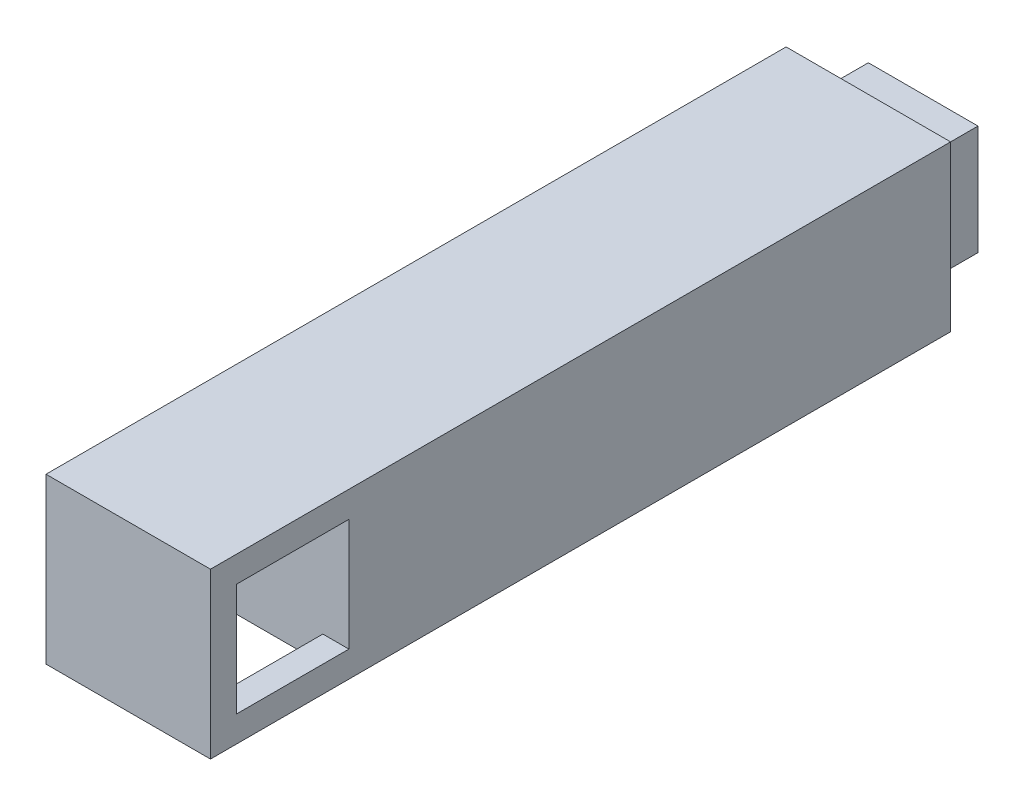
ISO-10303-21;
HEADER;
FILE_DESCRIPTION(('STEP AP214'),'2;1');
FILE_NAME('part.step','',(''),(''),'','','');
FILE_SCHEMA(('AUTOMOTIVE_DESIGN { 1 0 10303 214 1 1 1 1 }'));
ENDSEC;
DATA;
#1=APPLICATION_CONTEXT('core data for automotive mechanical design processes');
#2=APPLICATION_PROTOCOL_DEFINITION('international standard','automotive_design',2000,#1);
#3=PRODUCT_CONTEXT('',#1,'mechanical');
#4=PRODUCT('Part','Part','',(#3));
#5=PRODUCT_RELATED_PRODUCT_CATEGORY('part','',(#4));
#6=PRODUCT_DEFINITION_FORMATION('','',#4);
#7=PRODUCT_DEFINITION_CONTEXT('part definition',#1,'design');
#8=PRODUCT_DEFINITION('design','',#6,#7);
#9=PRODUCT_DEFINITION_SHAPE('','',#8);
#10=(LENGTH_UNIT() NAMED_UNIT(*) SI_UNIT(.MILLI.,.METRE.));
#11=(NAMED_UNIT(*) PLANE_ANGLE_UNIT() SI_UNIT($,.RADIAN.));
#12=(NAMED_UNIT(*) SI_UNIT($,.STERADIAN.) SOLID_ANGLE_UNIT());
#13=UNCERTAINTY_MEASURE_WITH_UNIT(LENGTH_MEASURE(1.E-05),#10,'distance_accuracy_value','');
#14=(GEOMETRIC_REPRESENTATION_CONTEXT(3) GLOBAL_UNCERTAINTY_ASSIGNED_CONTEXT((#13)) GLOBAL_UNIT_ASSIGNED_CONTEXT((#10,
#11,#12)) REPRESENTATION_CONTEXT('',''));
#15=CARTESIAN_POINT('',(0.,0.,0.));
#16=DIRECTION('',(0.,0.,1.));
#17=DIRECTION('',(1.,0.,0.));
#18=AXIS2_PLACEMENT_3D('',#15,#16,#17);
#19=CARTESIAN_POINT('',(0.,0.,0.));
#20=DIRECTION('',(1.,0.,0.));
#21=DIRECTION('',(0.,0.,-1.));
#22=AXIS2_PLACEMENT_3D('',#19,#20,#21);
#23=PLANE('',#22);
#24=DIRECTION('',(0.,-1.,0.));
#25=VECTOR('',#24,1.);
#26=CARTESIAN_POINT('',(0.,10.25,130.25));
#27=LINE('',#26,#25);
#28=CARTESIAN_POINT('',(0.,10.25,130.25));
#29=VERTEX_POINT('',#28);
#30=CARTESIAN_POINT('',(0.,0.,130.25));
#31=VERTEX_POINT('',#30);
#32=EDGE_CURVE('E188',#29,#31,#27,.T.);
#33=ORIENTED_EDGE('',*,*,#32,.T.);
#34=DIRECTION('',(0.,0.,-1.));
#35=VECTOR('',#34,1.);
#36=CARTESIAN_POINT('',(0.,0.,0.));
#37=LINE('',#36,#35);
#38=CARTESIAN_POINT('',(0.,0.,109.75));
#39=VERTEX_POINT('',#38);
#40=EDGE_CURVE('E51',#31,#39,#37,.T.);
#41=ORIENTED_EDGE('',*,*,#40,.T.);
#42=DIRECTION('',(0.,1.,0.));
#43=VECTOR('',#42,1.);
#44=CARTESIAN_POINT('',(0.,-10.25,109.75));
#45=LINE('',#44,#43);
#46=CARTESIAN_POINT('',(0.,10.25,109.75));
#47=VERTEX_POINT('',#46);
#48=EDGE_CURVE('E170',#39,#47,#45,.T.);
#49=ORIENTED_EDGE('',*,*,#48,.T.);
#50=DIRECTION('',(0.,0.,1.));
#51=VECTOR('',#50,1.);
#52=CARTESIAN_POINT('',(0.,10.25,109.75));
#53=LINE('',#52,#51);
#54=EDGE_CURVE('E192',#47,#29,#53,.T.);
#55=ORIENTED_EDGE('',*,*,#54,.T.);
#56=EDGE_LOOP('',(#33,#41,#49,#55));
#57=FACE_BOUND('',#56,.T.);
#58=ADVANCED_FACE('F43',(#57),#23,.T.);
#59=CARTESIAN_POINT('',(0.,0.,0.));
#60=DIRECTION('',(0.,0.,-1.));
#61=DIRECTION('',(-1.,0.,0.));
#62=AXIS2_PLACEMENT_3D('',#59,#60,#61);
#63=PLANE('',#62);
#64=DIRECTION('',(0.,-1.,0.));
#65=VECTOR('',#64,1.);
#66=CARTESIAN_POINT('',(-15.,-15.,0.));
#67=LINE('',#66,#65);
#68=CARTESIAN_POINT('',(-15.,15.,0.));
#69=VERTEX_POINT('',#68);
#70=CARTESIAN_POINT('',(-15.,-15.,0.));
#71=VERTEX_POINT('',#70);
#72=EDGE_CURVE('E241',#69,#71,#67,.T.);
#73=ORIENTED_EDGE('',*,*,#72,.F.);
#74=DIRECTION('',(-1.,0.,0.));
#75=VECTOR('',#74,1.);
#76=CARTESIAN_POINT('',(-15.,15.,0.));
#77=LINE('',#76,#75);
#78=CARTESIAN_POINT('',(15.,15.,0.));
#79=VERTEX_POINT('',#78);
#80=EDGE_CURVE('E255',#79,#69,#77,.T.);
#81=ORIENTED_EDGE('',*,*,#80,.F.);
#82=DIRECTION('',(0.,1.,0.));
#83=VECTOR('',#82,1.);
#84=CARTESIAN_POINT('',(15.,-15.,0.));
#85=LINE('',#84,#83);
#86=CARTESIAN_POINT('',(15.,-15.,0.));
#87=VERTEX_POINT('',#86);
#88=EDGE_CURVE('E264',#87,#79,#85,.T.);
#89=ORIENTED_EDGE('',*,*,#88,.F.);
#90=DIRECTION('',(1.,0.,0.));
#91=VECTOR('',#90,1.);
#92=CARTESIAN_POINT('',(-15.,-15.,0.));
#93=LINE('',#92,#91);
#94=EDGE_CURVE('E263',#71,#87,#93,.T.);
#95=ORIENTED_EDGE('',*,*,#94,.F.);
#96=EDGE_LOOP('',(#73,#81,#89,#95));
#97=FACE_BOUND('',#96,.T.);
#98=DIRECTION('',(-1.,0.,0.));
#99=VECTOR('',#98,1.);
#100=CARTESIAN_POINT('',(-10.,10.,0.));
#101=LINE('',#100,#99);
#102=CARTESIAN_POINT('',(10.,10.,0.));
#103=VERTEX_POINT('',#102);
#104=CARTESIAN_POINT('',(-10.,10.,0.));
#105=VERTEX_POINT('',#104);
#106=EDGE_CURVE('E222',#103,#105,#101,.T.);
#107=ORIENTED_EDGE('',*,*,#106,.T.);
#108=DIRECTION('',(0.,-1.,0.));
#109=VECTOR('',#108,1.);
#110=CARTESIAN_POINT('',(-10.,-10.,0.));
#111=LINE('',#110,#109);
#112=CARTESIAN_POINT('',(-10.,-10.,0.));
#113=VERTEX_POINT('',#112);
#114=EDGE_CURVE('E211',#105,#113,#111,.T.);
#115=ORIENTED_EDGE('',*,*,#114,.T.);
#116=DIRECTION('',(1.,0.,0.));
#117=VECTOR('',#116,1.);
#118=CARTESIAN_POINT('',(-10.,-10.,0.));
#119=LINE('',#118,#117);
#120=CARTESIAN_POINT('',(10.,-10.,0.));
#121=VERTEX_POINT('',#120);
#122=EDGE_CURVE('E231',#113,#121,#119,.T.);
#123=ORIENTED_EDGE('',*,*,#122,.T.);
#124=DIRECTION('',(0.,1.,0.));
#125=VECTOR('',#124,1.);
#126=CARTESIAN_POINT('',(10.,-10.,0.));
#127=LINE('',#126,#125);
#128=EDGE_CURVE('E237',#121,#103,#127,.T.);
#129=ORIENTED_EDGE('',*,*,#128,.T.);
#130=EDGE_LOOP('',(#107,#115,#123,#129));
#131=FACE_BOUND('',#130,.T.);
#132=ADVANCED_FACE('F312',(#97,#131),#63,.T.);
#133=CARTESIAN_POINT('',(-15.,-15.,135.));
#134=DIRECTION('',(1.,0.,0.));
#135=DIRECTION('',(0.,0.,-1.));
#136=AXIS2_PLACEMENT_3D('',#133,#134,#135);
#137=PLANE('',#136);
#138=ORIENTED_EDGE('',*,*,#72,.T.);
#139=DIRECTION('',(0.,0.,-1.));
#140=VECTOR('',#139,1.);
#141=CARTESIAN_POINT('',(-15.,-15.,135.));
#142=LINE('',#141,#140);
#143=CARTESIAN_POINT('',(-15.,-15.,135.));
#144=VERTEX_POINT('',#143);
#145=EDGE_CURVE('E277',#144,#71,#142,.T.);
#146=ORIENTED_EDGE('',*,*,#145,.F.);
#147=DIRECTION('',(0.,-1.,0.));
#148=VECTOR('',#147,1.);
#149=CARTESIAN_POINT('',(-15.,-15.,135.));
#150=LINE('',#149,#148);
#151=CARTESIAN_POINT('',(-15.,15.,135.));
#152=VERTEX_POINT('',#151);
#153=EDGE_CURVE('E247',#152,#144,#150,.T.);
#154=ORIENTED_EDGE('',*,*,#153,.F.);
#155=DIRECTION('',(0.,0.,-1.));
#156=VECTOR('',#155,1.);
#157=CARTESIAN_POINT('',(-15.,15.,135.));
#158=LINE('',#157,#156);
#159=EDGE_CURVE('E257',#152,#69,#158,.T.);
#160=ORIENTED_EDGE('',*,*,#159,.T.);
#161=EDGE_LOOP('',(#138,#146,#154,#160));
#162=FACE_BOUND('',#161,.T.);
#163=ADVANCED_FACE('F44',(#162),#137,.F.);
#164=CARTESIAN_POINT('',(-15.,-15.,135.));
#165=DIRECTION('',(0.,1.,0.));
#166=DIRECTION('',(0.,0.,1.));
#167=AXIS2_PLACEMENT_3D('',#164,#165,#166);
#168=PLANE('',#167);
#169=DIRECTION('',(1.,0.,0.));
#170=VECTOR('',#169,1.);
#171=CARTESIAN_POINT('',(-10.25,-15.,109.75));
#172=LINE('',#171,#170);
#173=CARTESIAN_POINT('',(-10.25,-15.,109.75));
#174=VERTEX_POINT('',#173);
#175=CARTESIAN_POINT('',(10.25,-15.,109.75));
#176=VERTEX_POINT('',#175);
#177=EDGE_CURVE('E177',#174,#176,#172,.T.);
#178=ORIENTED_EDGE('',*,*,#177,.F.);
#179=DIRECTION('',(0.,0.,-1.));
#180=VECTOR('',#179,1.);
#181=CARTESIAN_POINT('',(-10.25,-15.,130.25));
#182=LINE('',#181,#180);
#183=CARTESIAN_POINT('',(-10.25,-15.,130.25));
#184=VERTEX_POINT('',#183);
#185=EDGE_CURVE('E59',#184,#174,#182,.T.);
#186=ORIENTED_EDGE('',*,*,#185,.F.);
#187=DIRECTION('',(-1.,0.,0.));
#188=VECTOR('',#187,1.);
#189=CARTESIAN_POINT('',(10.25,-15.,130.25));
#190=LINE('',#189,#188);
#191=CARTESIAN_POINT('',(10.25,-15.,130.25));
#192=VERTEX_POINT('',#191);
#193=EDGE_CURVE('E175',#192,#184,#190,.T.);
#194=ORIENTED_EDGE('',*,*,#193,.F.);
#195=DIRECTION('',(0.,0.,1.));
#196=VECTOR('',#195,1.);
#197=CARTESIAN_POINT('',(10.25,-15.,109.75));
#198=LINE('',#197,#196);
#199=EDGE_CURVE('E173',#176,#192,#198,.T.);
#200=ORIENTED_EDGE('',*,*,#199,.F.);
#201=EDGE_LOOP('',(#178,#186,#194,#200));
#202=FACE_BOUND('',#201,.T.);
#203=ORIENTED_EDGE('',*,*,#94,.T.);
#204=DIRECTION('',(0.,0.,-1.));
#205=VECTOR('',#204,1.);
#206=CARTESIAN_POINT('',(15.,-15.,135.));
#207=LINE('',#206,#205);
#208=CARTESIAN_POINT('',(15.,-15.,135.));
#209=VERTEX_POINT('',#208);
#210=EDGE_CURVE('E272',#209,#87,#207,.T.);
#211=ORIENTED_EDGE('',*,*,#210,.F.);
#212=DIRECTION('',(1.,0.,0.));
#213=VECTOR('',#212,1.);
#214=CARTESIAN_POINT('',(-15.,-15.,135.));
#215=LINE('',#214,#213);
#216=EDGE_CURVE('E251',#144,#209,#215,.T.);
#217=ORIENTED_EDGE('',*,*,#216,.F.);
#218=ORIENTED_EDGE('',*,*,#145,.T.);
#219=EDGE_LOOP('',(#203,#211,#217,#218));
#220=FACE_BOUND('',#219,.T.);
#221=ADVANCED_FACE('F288',(#202,#220),#168,.F.);
#222=CARTESIAN_POINT('',(15.,-15.,135.));
#223=DIRECTION('',(-1.,0.,0.));
#224=DIRECTION('',(0.,0.,1.));
#225=AXIS2_PLACEMENT_3D('',#222,#223,#224);
#226=PLANE('',#225);
#227=DIRECTION('',(0.,0.,-1.));
#228=VECTOR('',#227,1.);
#229=CARTESIAN_POINT('',(15.,-10.25,130.25));
#230=LINE('',#229,#228);
#231=CARTESIAN_POINT('',(15.,-10.25,130.25));
#232=VERTEX_POINT('',#231);
#233=CARTESIAN_POINT('',(15.,-10.25,109.75));
#234=VERTEX_POINT('',#233);
#235=EDGE_CURVE('E203',#232,#234,#230,.T.);
#236=ORIENTED_EDGE('',*,*,#235,.F.);
#237=DIRECTION('',(0.,-1.,0.));
#238=VECTOR('',#237,1.);
#239=CARTESIAN_POINT('',(15.,10.25,130.25));
#240=LINE('',#239,#238);
#241=CARTESIAN_POINT('',(15.,10.25,130.25));
#242=VERTEX_POINT('',#241);
#243=EDGE_CURVE('E187',#242,#232,#240,.T.);
#244=ORIENTED_EDGE('',*,*,#243,.F.);
#245=DIRECTION('',(0.,0.,1.));
#246=VECTOR('',#245,1.);
#247=CARTESIAN_POINT('',(15.,10.25,109.75));
#248=LINE('',#247,#246);
#249=CARTESIAN_POINT('',(15.,10.25,109.75));
#250=VERTEX_POINT('',#249);
#251=EDGE_CURVE('E191',#250,#242,#248,.T.);
#252=ORIENTED_EDGE('',*,*,#251,.F.);
#253=DIRECTION('',(0.,1.,0.));
#254=VECTOR('',#253,1.);
#255=CARTESIAN_POINT('',(15.,-10.25,109.75));
#256=LINE('',#255,#254);
#257=EDGE_CURVE('E204',#234,#250,#256,.T.);
#258=ORIENTED_EDGE('',*,*,#257,.F.);
#259=EDGE_LOOP('',(#236,#244,#252,#258));
#260=FACE_BOUND('',#259,.T.);
#261=ORIENTED_EDGE('',*,*,#88,.T.);
#262=DIRECTION('',(0.,0.,-1.));
#263=VECTOR('',#262,1.);
#264=CARTESIAN_POINT('',(15.,15.,135.));
#265=LINE('',#264,#263);
#266=CARTESIAN_POINT('',(15.,15.,135.));
#267=VERTEX_POINT('',#266);
#268=EDGE_CURVE('E269',#267,#79,#265,.T.);
#269=ORIENTED_EDGE('',*,*,#268,.F.);
#270=DIRECTION('',(0.,1.,0.));
#271=VECTOR('',#270,1.);
#272=CARTESIAN_POINT('',(15.,-15.,135.));
#273=LINE('',#272,#271);
#274=EDGE_CURVE('E258',#209,#267,#273,.T.);
#275=ORIENTED_EDGE('',*,*,#274,.F.);
#276=ORIENTED_EDGE('',*,*,#210,.T.);
#277=EDGE_LOOP('',(#261,#269,#275,#276));
#278=FACE_BOUND('',#277,.T.);
#279=ADVANCED_FACE('F299',(#260,#278),#226,.F.);
#280=CARTESIAN_POINT('',(-15.,15.,135.));
#281=DIRECTION('',(0.,-1.,0.));
#282=DIRECTION('',(0.,0.,-1.));
#283=AXIS2_PLACEMENT_3D('',#280,#281,#282);
#284=PLANE('',#283);
#285=ORIENTED_EDGE('',*,*,#80,.T.);
#286=ORIENTED_EDGE('',*,*,#159,.F.);
#287=DIRECTION('',(-1.,0.,0.));
#288=VECTOR('',#287,1.);
#289=CARTESIAN_POINT('',(-15.,15.,135.));
#290=LINE('',#289,#288);
#291=EDGE_CURVE('E256',#267,#152,#290,.T.);
#292=ORIENTED_EDGE('',*,*,#291,.F.);
#293=ORIENTED_EDGE('',*,*,#268,.T.);
#294=EDGE_LOOP('',(#285,#286,#292,#293));
#295=FACE_BOUND('',#294,.T.);
#296=ADVANCED_FACE('F378',(#295),#284,.F.);
#297=CARTESIAN_POINT('',(0.,0.,135.));
#298=DIRECTION('',(0.,0.,-1.));
#299=DIRECTION('',(-1.,0.,0.));
#300=AXIS2_PLACEMENT_3D('',#297,#298,#299);
#301=PLANE('',#300);
#302=ORIENTED_EDGE('',*,*,#153,.T.);
#303=ORIENTED_EDGE('',*,*,#216,.T.);
#304=ORIENTED_EDGE('',*,*,#274,.T.);
#305=ORIENTED_EDGE('',*,*,#291,.T.);
#306=EDGE_LOOP('',(#302,#303,#304,#305));
#307=FACE_BOUND('',#306,.T.);
#308=ADVANCED_FACE('F389',(#307),#301,.F.);
#309=CARTESIAN_POINT('',(-10.,-10.,-10.));
#310=DIRECTION('',(-1.,0.,0.));
#311=DIRECTION('',(0.,0.,1.));
#312=AXIS2_PLACEMENT_3D('',#309,#310,#311);
#313=PLANE('',#312);
#314=ORIENTED_EDGE('',*,*,#114,.F.);
#315=DIRECTION('',(0.,0.,1.));
#316=VECTOR('',#315,1.);
#317=CARTESIAN_POINT('',(-10.,10.,-10.));
#318=LINE('',#317,#316);
#319=CARTESIAN_POINT('',(-10.,10.,-10.));
#320=VERTEX_POINT('',#319);
#321=EDGE_CURVE('E242',#320,#105,#318,.T.);
#322=ORIENTED_EDGE('',*,*,#321,.F.);
#323=DIRECTION('',(0.,-1.,0.));
#324=VECTOR('',#323,1.);
#325=CARTESIAN_POINT('',(-10.,-10.,-10.));
#326=LINE('',#325,#324);
#327=CARTESIAN_POINT('',(-10.,-10.,-10.));
#328=VERTEX_POINT('',#327);
#329=EDGE_CURVE('E220',#320,#328,#326,.T.);
#330=ORIENTED_EDGE('',*,*,#329,.T.);
#331=DIRECTION('',(0.,0.,1.));
#332=VECTOR('',#331,1.);
#333=CARTESIAN_POINT('',(-10.,-10.,-10.));
#334=LINE('',#333,#332);
#335=EDGE_CURVE('E228',#328,#113,#334,.T.);
#336=ORIENTED_EDGE('',*,*,#335,.T.);
#337=EDGE_LOOP('',(#314,#322,#330,#336));
#338=FACE_BOUND('',#337,.T.);
#339=ADVANCED_FACE('F396',(#338),#313,.T.);
#340=CARTESIAN_POINT('',(-10.,10.,-10.));
#341=DIRECTION('',(0.,1.,0.));
#342=DIRECTION('',(0.,0.,1.));
#343=AXIS2_PLACEMENT_3D('',#340,#341,#342);
#344=PLANE('',#343);
#345=ORIENTED_EDGE('',*,*,#106,.F.);
#346=DIRECTION('',(0.,0.,1.));
#347=VECTOR('',#346,1.);
#348=CARTESIAN_POINT('',(10.,10.,-10.));
#349=LINE('',#348,#347);
#350=CARTESIAN_POINT('',(10.,10.,-10.));
#351=VERTEX_POINT('',#350);
#352=EDGE_CURVE('E243',#351,#103,#349,.T.);
#353=ORIENTED_EDGE('',*,*,#352,.F.);
#354=DIRECTION('',(-1.,0.,0.));
#355=VECTOR('',#354,1.);
#356=CARTESIAN_POINT('',(-10.,10.,-10.));
#357=LINE('',#356,#355);
#358=EDGE_CURVE('E230',#351,#320,#357,.T.);
#359=ORIENTED_EDGE('',*,*,#358,.T.);
#360=ORIENTED_EDGE('',*,*,#321,.T.);
#361=EDGE_LOOP('',(#345,#353,#359,#360));
#362=FACE_BOUND('',#361,.T.);
#363=ADVANCED_FACE('F411',(#362),#344,.T.);
#364=CARTESIAN_POINT('',(10.,-10.,-10.));
#365=DIRECTION('',(1.,0.,0.));
#366=DIRECTION('',(0.,0.,-1.));
#367=AXIS2_PLACEMENT_3D('',#364,#365,#366);
#368=PLANE('',#367);
#369=ORIENTED_EDGE('',*,*,#128,.F.);
#370=DIRECTION('',(0.,0.,1.));
#371=VECTOR('',#370,1.);
#372=CARTESIAN_POINT('',(10.,-10.,-10.));
#373=LINE('',#372,#371);
#374=CARTESIAN_POINT('',(10.,-10.,-10.));
#375=VERTEX_POINT('',#374);
#376=EDGE_CURVE('E250',#375,#121,#373,.T.);
#377=ORIENTED_EDGE('',*,*,#376,.F.);
#378=DIRECTION('',(0.,1.,0.));
#379=VECTOR('',#378,1.);
#380=CARTESIAN_POINT('',(10.,-10.,-10.));
#381=LINE('',#380,#379);
#382=EDGE_CURVE('E221',#375,#351,#381,.T.);
#383=ORIENTED_EDGE('',*,*,#382,.T.);
#384=ORIENTED_EDGE('',*,*,#352,.T.);
#385=EDGE_LOOP('',(#369,#377,#383,#384));
#386=FACE_BOUND('',#385,.T.);
#387=ADVANCED_FACE('F421',(#386),#368,.T.);
#388=CARTESIAN_POINT('',(-10.,-10.,-10.));
#389=DIRECTION('',(0.,-1.,0.));
#390=DIRECTION('',(0.,0.,-1.));
#391=AXIS2_PLACEMENT_3D('',#388,#389,#390);
#392=PLANE('',#391);
#393=ORIENTED_EDGE('',*,*,#122,.F.);
#394=ORIENTED_EDGE('',*,*,#335,.F.);
#395=DIRECTION('',(1.,0.,0.));
#396=VECTOR('',#395,1.);
#397=CARTESIAN_POINT('',(-10.,-10.,-10.));
#398=LINE('',#397,#396);
#399=EDGE_CURVE('E219',#328,#375,#398,.T.);
#400=ORIENTED_EDGE('',*,*,#399,.T.);
#401=ORIENTED_EDGE('',*,*,#376,.T.);
#402=EDGE_LOOP('',(#393,#394,#400,#401));
#403=FACE_BOUND('',#402,.T.);
#404=ADVANCED_FACE('F433',(#403),#392,.T.);
#405=CARTESIAN_POINT('',(0.,0.,-10.));
#406=DIRECTION('',(0.,0.,-1.));
#407=DIRECTION('',(-1.,0.,0.));
#408=AXIS2_PLACEMENT_3D('',#405,#406,#407);
#409=PLANE('',#408);
#410=ORIENTED_EDGE('',*,*,#329,.F.);
#411=ORIENTED_EDGE('',*,*,#358,.F.);
#412=ORIENTED_EDGE('',*,*,#382,.F.);
#413=ORIENTED_EDGE('',*,*,#399,.F.);
#414=EDGE_LOOP('',(#410,#411,#412,#413));
#415=FACE_BOUND('',#414,.T.);
#416=ADVANCED_FACE('F315',(#415),#409,.T.);
#417=CARTESIAN_POINT('',(0.,10.25,130.25));
#418=DIRECTION('',(0.,0.,1.));
#419=DIRECTION('',(1.,0.,0.));
#420=AXIS2_PLACEMENT_3D('',#417,#418,#419);
#421=PLANE('',#420);
#422=DIRECTION('',(1.,0.,0.));
#423=VECTOR('',#422,1.);
#424=CARTESIAN_POINT('',(0.,-10.25,130.25));
#425=LINE('',#424,#423);
#426=CARTESIAN_POINT('',(10.25,-10.25,130.25));
#427=VERTEX_POINT('',#426);
#428=EDGE_CURVE('E196',#427,#232,#425,.T.);
#429=ORIENTED_EDGE('',*,*,#428,.F.);
#430=DIRECTION('',(0.,-1.,0.));
#431=VECTOR('',#430,1.);
#432=CARTESIAN_POINT('',(10.25,0.,130.25));
#433=LINE('',#432,#431);
#434=EDGE_CURVE('E190',#427,#192,#433,.T.);
#435=ORIENTED_EDGE('',*,*,#434,.T.);
#436=ORIENTED_EDGE('',*,*,#193,.T.);
#437=DIRECTION('',(0.,-1.,0.));
#438=VECTOR('',#437,1.);
#439=CARTESIAN_POINT('',(-10.25,0.,130.25));
#440=LINE('',#439,#438);
#441=CARTESIAN_POINT('',(-10.25,0.,130.25));
#442=VERTEX_POINT('',#441);
#443=EDGE_CURVE('E184',#442,#184,#440,.T.);
#444=ORIENTED_EDGE('',*,*,#443,.F.);
#445=DIRECTION('',(-1.,0.,0.));
#446=VECTOR('',#445,1.);
#447=CARTESIAN_POINT('',(10.25,0.,130.25));
#448=LINE('',#447,#446);
#449=EDGE_CURVE('E165',#31,#442,#448,.T.);
#450=ORIENTED_EDGE('',*,*,#449,.F.);
#451=ORIENTED_EDGE('',*,*,#32,.F.);
#452=DIRECTION('',(1.,0.,0.));
#453=VECTOR('',#452,1.);
#454=CARTESIAN_POINT('',(0.,10.25,130.25));
#455=LINE('',#454,#453);
#456=EDGE_CURVE('E207',#29,#242,#455,.T.);
#457=ORIENTED_EDGE('',*,*,#456,.T.);
#458=ORIENTED_EDGE('',*,*,#243,.T.);
#459=EDGE_LOOP('',(#429,#435,#436,#444,#450,#451,#457,#458));
#460=FACE_BOUND('',#459,.T.);
#461=ADVANCED_FACE('F285',(#460),#421,.F.);
#462=CARTESIAN_POINT('',(0.,10.25,109.75));
#463=DIRECTION('',(0.,1.,0.));
#464=DIRECTION('',(0.,0.,1.));
#465=AXIS2_PLACEMENT_3D('',#462,#463,#464);
#466=PLANE('',#465);
#467=ORIENTED_EDGE('',*,*,#251,.T.);
#468=ORIENTED_EDGE('',*,*,#456,.F.);
#469=ORIENTED_EDGE('',*,*,#54,.F.);
#470=DIRECTION('',(1.,0.,0.));
#471=VECTOR('',#470,1.);
#472=CARTESIAN_POINT('',(0.,10.25,109.75));
#473=LINE('',#472,#471);
#474=EDGE_CURVE('E215',#47,#250,#473,.T.);
#475=ORIENTED_EDGE('',*,*,#474,.T.);
#476=EDGE_LOOP('',(#467,#468,#469,#475));
#477=FACE_BOUND('',#476,.T.);
#478=ADVANCED_FACE('F305',(#477),#466,.F.);
#479=CARTESIAN_POINT('',(0.,-10.25,109.75));
#480=DIRECTION('',(0.,0.,-1.));
#481=DIRECTION('',(-1.,0.,0.));
#482=AXIS2_PLACEMENT_3D('',#479,#480,#481);
#483=PLANE('',#482);
#484=ORIENTED_EDGE('',*,*,#48,.F.);
#485=DIRECTION('',(1.,0.,0.));
#486=VECTOR('',#485,1.);
#487=CARTESIAN_POINT('',(-10.25,0.,109.75));
#488=LINE('',#487,#486);
#489=CARTESIAN_POINT('',(-10.25,0.,109.75));
#490=VERTEX_POINT('',#489);
#491=EDGE_CURVE('E68',#490,#39,#488,.T.);
#492=ORIENTED_EDGE('',*,*,#491,.F.);
#493=DIRECTION('',(0.,-1.,0.));
#494=VECTOR('',#493,1.);
#495=CARTESIAN_POINT('',(-10.25,0.,109.75));
#496=LINE('',#495,#494);
#497=EDGE_CURVE('E154',#490,#174,#496,.T.);
#498=ORIENTED_EDGE('',*,*,#497,.T.);
#499=ORIENTED_EDGE('',*,*,#177,.T.);
#500=DIRECTION('',(0.,-1.,0.));
#501=VECTOR('',#500,1.);
#502=CARTESIAN_POINT('',(10.25,0.,109.75));
#503=LINE('',#502,#501);
#504=CARTESIAN_POINT('',(10.25,-10.25,109.75));
#505=VERTEX_POINT('',#504);
#506=EDGE_CURVE('E161',#505,#176,#503,.T.);
#507=ORIENTED_EDGE('',*,*,#506,.F.);
#508=DIRECTION('',(1.,0.,0.));
#509=VECTOR('',#508,1.);
#510=CARTESIAN_POINT('',(0.,-10.25,109.75));
#511=LINE('',#510,#509);
#512=EDGE_CURVE('E212',#505,#234,#511,.T.);
#513=ORIENTED_EDGE('',*,*,#512,.T.);
#514=ORIENTED_EDGE('',*,*,#257,.T.);
#515=ORIENTED_EDGE('',*,*,#474,.F.);
#516=EDGE_LOOP('',(#484,#492,#498,#499,#507,#513,#514,#515));
#517=FACE_BOUND('',#516,.T.);
#518=ADVANCED_FACE('F164',(#517),#483,.F.);
#519=CARTESIAN_POINT('',(0.,-10.25,130.25));
#520=DIRECTION('',(0.,-1.,0.));
#521=DIRECTION('',(0.,0.,-1.));
#522=AXIS2_PLACEMENT_3D('',#519,#520,#521);
#523=PLANE('',#522);
#524=ORIENTED_EDGE('',*,*,#512,.F.);
#525=DIRECTION('',(0.,0.,1.));
#526=VECTOR('',#525,1.);
#527=CARTESIAN_POINT('',(10.25,-10.25,130.25));
#528=LINE('',#527,#526);
#529=EDGE_CURVE('E11',#505,#427,#528,.T.);
#530=ORIENTED_EDGE('',*,*,#529,.T.);
#531=ORIENTED_EDGE('',*,*,#428,.T.);
#532=ORIENTED_EDGE('',*,*,#235,.T.);
#533=EDGE_LOOP('',(#524,#530,#531,#532));
#534=FACE_BOUND('',#533,.T.);
#535=ADVANCED_FACE('F295',(#534),#523,.F.);
#536=CARTESIAN_POINT('',(10.25,0.,109.75));
#537=DIRECTION('',(1.,0.,0.));
#538=DIRECTION('',(0.,0.,-1.));
#539=AXIS2_PLACEMENT_3D('',#536,#537,#538);
#540=PLANE('',#539);
#541=ORIENTED_EDGE('',*,*,#506,.T.);
#542=ORIENTED_EDGE('',*,*,#199,.T.);
#543=ORIENTED_EDGE('',*,*,#434,.F.);
#544=ORIENTED_EDGE('',*,*,#529,.F.);
#545=EDGE_LOOP('',(#541,#542,#543,#544));
#546=FACE_BOUND('',#545,.T.);
#547=ADVANCED_FACE('F324',(#546),#540,.F.);
#548=CARTESIAN_POINT('',(-10.25,0.,130.25));
#549=DIRECTION('',(-1.,0.,0.));
#550=DIRECTION('',(0.,0.,1.));
#551=AXIS2_PLACEMENT_3D('',#548,#549,#550);
#552=PLANE('',#551);
#553=ORIENTED_EDGE('',*,*,#185,.T.);
#554=ORIENTED_EDGE('',*,*,#497,.F.);
#555=DIRECTION('',(0.,0.,-1.));
#556=VECTOR('',#555,1.);
#557=CARTESIAN_POINT('',(-10.25,0.,130.25));
#558=LINE('',#557,#556);
#559=EDGE_CURVE('E160',#442,#490,#558,.T.);
#560=ORIENTED_EDGE('',*,*,#559,.F.);
#561=ORIENTED_EDGE('',*,*,#443,.T.);
#562=EDGE_LOOP('',(#553,#554,#560,#561));
#563=FACE_BOUND('',#562,.T.);
#564=ADVANCED_FACE('F156',(#563),#552,.F.);
#565=CARTESIAN_POINT('',(0.,0.,0.));
#566=DIRECTION('',(0.,-1.,0.));
#567=DIRECTION('',(0.,0.,-1.));
#568=AXIS2_PLACEMENT_3D('',#565,#566,#567);
#569=PLANE('',#568);
#570=ORIENTED_EDGE('',*,*,#449,.T.);
#571=ORIENTED_EDGE('',*,*,#559,.T.);
#572=ORIENTED_EDGE('',*,*,#491,.T.);
#573=ORIENTED_EDGE('',*,*,#40,.F.);
#574=EDGE_LOOP('',(#570,#571,#572,#573));
#575=FACE_BOUND('',#574,.T.);
#576=ADVANCED_FACE('F166',(#575),#569,.T.);
#577=CLOSED_SHELL('',(#58,#132,#163,#221,#279,#296,#308,#339,#363,#387,#404,#416,#461,#478,#518,
#535,#547,#564,#576));
#578=MANIFOLD_SOLID_BREP('B2',#577);
#579=ADVANCED_BREP_SHAPE_REPRESENTATION('',(#18,#578),#14);
#580=SHAPE_DEFINITION_REPRESENTATION(#9,#579);
ENDSEC;
END-ISO-10303-21;
